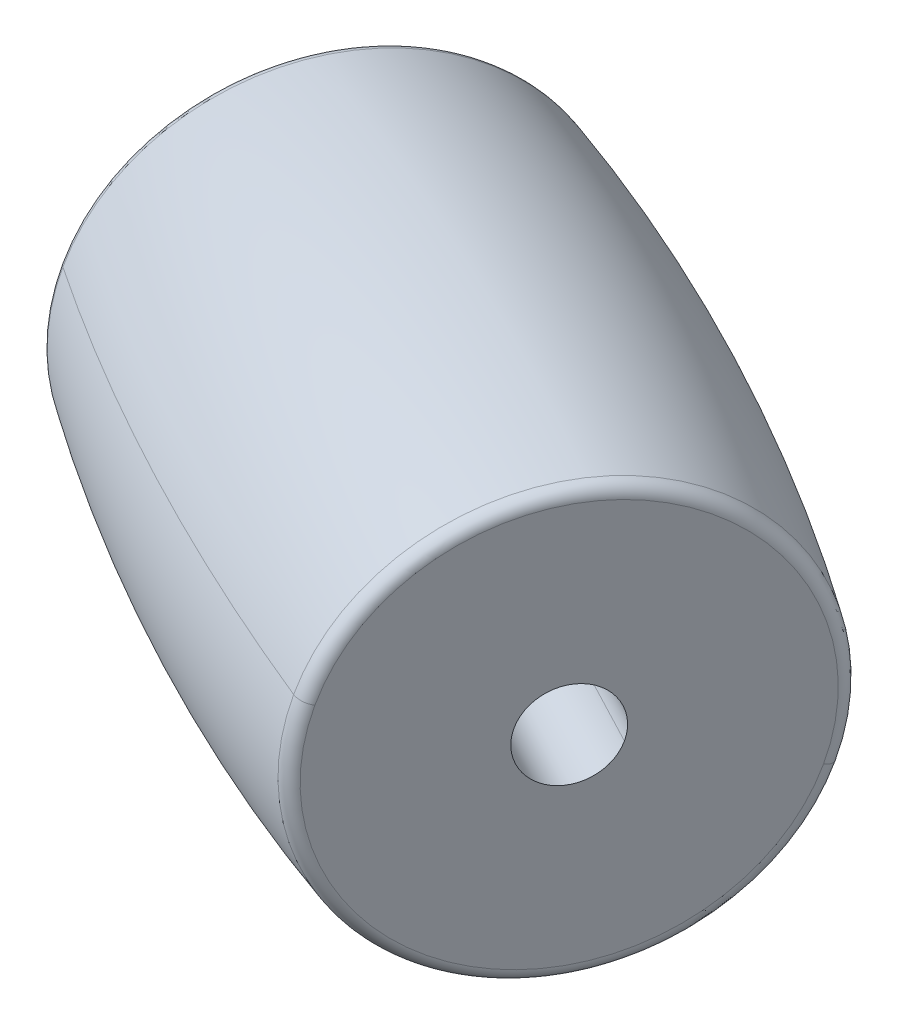
ISO-10303-21;
HEADER;
FILE_DESCRIPTION(('STEP AP214'),'2;1');
FILE_NAME('part.step','',(''),(''),'','','');
FILE_SCHEMA(('AUTOMOTIVE_DESIGN { 1 0 10303 214 1 1 1 1 }'));
ENDSEC;
DATA;
#1=APPLICATION_CONTEXT('core data for automotive mechanical design processes');
#2=APPLICATION_PROTOCOL_DEFINITION('international standard','automotive_design',2000,#1);
#3=PRODUCT_CONTEXT('',#1,'mechanical');
#4=PRODUCT('Part','Part','',(#3));
#5=PRODUCT_RELATED_PRODUCT_CATEGORY('part','',(#4));
#6=PRODUCT_DEFINITION_FORMATION('','',#4);
#7=PRODUCT_DEFINITION_CONTEXT('part definition',#1,'design');
#8=PRODUCT_DEFINITION('design','',#6,#7);
#9=PRODUCT_DEFINITION_SHAPE('','',#8);
#10=(LENGTH_UNIT() NAMED_UNIT(*) SI_UNIT(.MILLI.,.METRE.));
#11=(NAMED_UNIT(*) PLANE_ANGLE_UNIT() SI_UNIT($,.RADIAN.));
#12=(NAMED_UNIT(*) SI_UNIT($,.STERADIAN.) SOLID_ANGLE_UNIT());
#13=UNCERTAINTY_MEASURE_WITH_UNIT(LENGTH_MEASURE(1.E-05),#10,'distance_accuracy_value','');
#14=(GEOMETRIC_REPRESENTATION_CONTEXT(3) GLOBAL_UNCERTAINTY_ASSIGNED_CONTEXT((#13)) GLOBAL_UNIT_ASSIGNED_CONTEXT((#10,
#11,#12)) REPRESENTATION_CONTEXT('',''));
#15=CARTESIAN_POINT('',(0.,0.,0.));
#16=DIRECTION('',(0.,0.,1.));
#17=DIRECTION('',(1.,0.,0.));
#18=AXIS2_PLACEMENT_3D('',#15,#16,#17);
#19=CARTESIAN_POINT('',(7.64193139777357,7.10002,-47.3864496764052));
#20=DIRECTION('',(0.885456025653216,0.,0.464723172043757));
#21=DIRECTION('',(0.439263469313461,-0.326447496805942,-0.836946614997538));
#22=AXIS2_PLACEMENT_3D('',#19,#20,#21);
#23=CYLINDRICAL_SURFACE('',#22,1.);
#24=DIRECTION('',(0.885456025653216,0.,0.464723172043757));
#25=VECTOR('',#24,1.);
#26=CARTESIAN_POINT('',(7.20266792846011,7.42646749680594,-46.5495030614076));
#27=LINE('',#26,#25);
#28=CARTESIAN_POINT('',(14.8662783210863,7.42646749680594,-42.5273300479693));
#29=VERTEX_POINT('',#28);
#30=CARTESIAN_POINT('',(26.5542978597088,7.42646749680594,-36.3929841769917));
#31=VERTEX_POINT('',#30);
#32=EDGE_CURVE('E154',#29,#31,#27,.T.);
#33=ORIENTED_EDGE('',*,*,#32,.F.);
#34=CARTESIAN_POINT('',(15.3055417903998,7.10002,-43.3642766629668));
#35=DIRECTION('',(-0.885456025653216,0.,-0.464723172043757));
#36=DIRECTION('',(0.439263469313461,-0.326447496805942,-0.836946614997538));
#37=AXIS2_PLACEMENT_3D('',#34,#35,#36);
#38=CIRCLE('',#37,1.);
#39=CARTESIAN_POINT('',(15.7448052597132,6.77357250319406,-44.2012232779643));
#40=VERTEX_POINT('',#39);
#41=EDGE_CURVE('E11',#29,#40,#38,.T.);
#42=ORIENTED_EDGE('',*,*,#41,.T.);
#43=DIRECTION('',(0.885456025653216,0.,0.464723172043757));
#44=VECTOR('',#43,1.);
#45=CARTESIAN_POINT('',(8.08119486708703,6.77357250319406,-48.2233962914027));
#46=LINE('',#45,#44);
#47=CARTESIAN_POINT('',(27.4328247983357,6.77357250319406,-38.0668774069867));
#48=VERTEX_POINT('',#47);
#49=EDGE_CURVE('E141',#40,#48,#46,.T.);
#50=ORIENTED_EDGE('',*,*,#49,.T.);
#51=CARTESIAN_POINT('',(26.9935613290222,7.10002,-37.2299307919892));
#52=DIRECTION('',(0.885456025653216,0.,0.464723172043757));
#53=DIRECTION('',(0.439263469313461,-0.326447496805942,-0.836946614997538));
#54=AXIS2_PLACEMENT_3D('',#51,#52,#53);
#55=CIRCLE('',#54,1.);
#56=EDGE_CURVE('E76',#48,#31,#55,.T.);
#57=ORIENTED_EDGE('',*,*,#56,.T.);
#58=EDGE_LOOP('',(#33,#42,#50,#57));
#59=FACE_BOUND('',#58,.T.);
#60=ADVANCED_FACE('F17',(#59),#23,.F.);
#61=CARTESIAN_POINT('',(26.7279245213263,7.10002,-37.3693477436023));
#62=DIRECTION('',(-0.885456025653216,0.,-0.464723172043757));
#63=DIRECTION('',(-0.439263469313461,0.326447496805942,0.836946614997538));
#64=AXIS2_PLACEMENT_3D('',#61,#62,#63);
#65=TOROIDAL_SURFACE('',#64,4.60548872129678,0.3);
#66=CARTESIAN_POINT('',(28.7509474749271,5.59656973536467,-41.223895939301));
#67=DIRECTION('',(0.151707716221402,0.945215336221929,-0.28905490310623));
#68=DIRECTION('',(0.439263469313461,-0.326447496805942,-0.836946614997538));
#69=AXIS2_PLACEMENT_3D('',#66,#67,#68);
#70=CIRCLE('',#69,0.3);
#71=CARTESIAN_POINT('',(29.0165842826231,5.59656973536467,-41.0844789876879));
#72=VERTEX_POINT('',#71);
#73=CARTESIAN_POINT('',(28.9148358933567,5.49940055891335,-41.4556258196627));
#74=VERTEX_POINT('',#73);
#75=EDGE_CURVE('E140',#72,#74,#70,.T.);
#76=ORIENTED_EDGE('',*,*,#75,.F.);
#77=CARTESIAN_POINT('',(26.9935613290222,7.10002,-37.2299307919892));
#78=DIRECTION('',(0.885456025653216,0.,0.464723172043757));
#79=DIRECTION('',(-0.439263469313461,0.326447496805942,0.836946614997538));
#80=AXIS2_PLACEMENT_3D('',#77,#78,#79);
#81=CIRCLE('',#80,4.60548872129678);
#82=CARTESIAN_POINT('',(24.9705383754214,8.60347026463533,-33.3753825962905));
#83=VERTEX_POINT('',#82);
#84=EDGE_CURVE('E132',#83,#72,#81,.T.);
#85=ORIENTED_EDGE('',*,*,#84,.F.);
#86=CARTESIAN_POINT('',(24.7049015677254,8.60347026463533,-33.5147995479037));
#87=DIRECTION('',(-0.151707716221402,-0.945215336221929,0.28905490310623));
#88=DIRECTION('',(-0.439263469313461,0.326447496805942,0.836946614997538));
#89=AXIS2_PLACEMENT_3D('',#86,#87,#88);
#90=CIRCLE('',#89,0.3);
#91=CARTESIAN_POINT('',(24.6072908478497,8.70063944108665,-33.2482844479316));
#92=VERTEX_POINT('',#91);
#93=EDGE_CURVE('E119',#83,#92,#90,.T.);
#94=ORIENTED_EDGE('',*,*,#93,.T.);
#95=CARTESIAN_POINT('',(26.7610633706032,7.10002,-37.3519551337971));
#96=DIRECTION('',(-0.885456025653216,0.,-0.464723172043757));
#97=DIRECTION('',(-0.439263469313461,0.326447496805942,0.836946614997538));
#98=AXIS2_PLACEMENT_3D('',#95,#96,#97);
#99=CIRCLE('',#98,4.90314508993815);
#100=EDGE_CURVE('E130',#74,#92,#99,.T.);
#101=ORIENTED_EDGE('',*,*,#100,.F.);
#102=EDGE_LOOP('',(#76,#85,#94,#101));
#103=FACE_BOUND('',#102,.T.);
#104=ADVANCED_FACE('F186',(#103),#65,.T.);
#105=CARTESIAN_POINT('',(15.5711785980957,7.10002,-43.2248597113537));
#106=DIRECTION('',(0.885456025653216,0.,0.464723172043757));
#107=DIRECTION('',(0.439263469313461,-0.326447496805942,-0.836946614997538));
#108=AXIS2_PLACEMENT_3D('',#105,#106,#107);
#109=TOROIDAL_SURFACE('',#108,4.60548872129678,0.3);
#110=CARTESIAN_POINT('',(13.5481556444949,8.60347026463533,-39.370311515655));
#111=DIRECTION('',(0.151707716221402,0.945215336221929,-0.28905490310623));
#112=DIRECTION('',(0.439263469313461,-0.326447496805942,-0.836946614997538));
#113=AXIS2_PLACEMENT_3D('',#110,#111,#112);
#114=CIRCLE('',#113,0.3);
#115=CARTESIAN_POINT('',(13.2825188367989,8.60347026463533,-39.5097284672681));
#116=VERTEX_POINT('',#115);
#117=CARTESIAN_POINT('',(13.3842672260653,8.70063944108665,-39.1385816352933));
#118=VERTEX_POINT('',#117);
#119=EDGE_CURVE('E106',#116,#118,#114,.T.);
#120=ORIENTED_EDGE('',*,*,#119,.F.);
#121=CARTESIAN_POINT('',(15.3055417903998,7.10002,-43.3642766629668));
#122=DIRECTION('',(-0.885456025653216,0.,-0.464723172043757));
#123=DIRECTION('',(0.439263469313461,-0.326447496805942,-0.836946614997538));
#124=AXIS2_PLACEMENT_3D('',#121,#122,#123);
#125=CIRCLE('',#124,4.60548872129678);
#126=CARTESIAN_POINT('',(17.3285647440006,5.59656973536467,-47.2188248586655));
#127=VERTEX_POINT('',#126);
#128=EDGE_CURVE('E21',#127,#116,#125,.T.);
#129=ORIENTED_EDGE('',*,*,#128,.F.);
#130=CARTESIAN_POINT('',(17.5942015516966,5.59656973536467,-47.0794079070523));
#131=DIRECTION('',(-0.151707716221402,-0.945215336221929,0.28905490310623));
#132=DIRECTION('',(-0.439263469313461,0.326447496805942,0.836946614997538));
#133=AXIS2_PLACEMENT_3D('',#130,#131,#132);
#134=CIRCLE('',#133,0.3);
#135=CARTESIAN_POINT('',(17.6918122715723,5.49940055891335,-47.3459230070244));
#136=VERTEX_POINT('',#135);
#137=EDGE_CURVE('E103',#127,#136,#134,.T.);
#138=ORIENTED_EDGE('',*,*,#137,.T.);
#139=CARTESIAN_POINT('',(15.5380397488188,7.10002,-43.2422523211589));
#140=DIRECTION('',(0.885456025653216,0.,0.464723172043757));
#141=DIRECTION('',(0.439263469313461,-0.326447496805942,-0.836946614997538));
#142=AXIS2_PLACEMENT_3D('',#139,#140,#141);
#143=CIRCLE('',#142,4.90314508993815);
#144=EDGE_CURVE('E42',#118,#136,#143,.T.);
#145=ORIENTED_EDGE('',*,*,#144,.F.);
#146=EDGE_LOOP('',(#120,#129,#138,#145));
#147=FACE_BOUND('',#146,.T.);
#148=ADVANCED_FACE('F102',(#147),#109,.T.);
#149=CARTESIAN_POINT('',(16.0442726803153,11.7026848075697,-44.7718107760931));
#150=DIRECTION('',(0.885456025653216,0.,0.464723172043757));
#151=DIRECTION('',(0.439263469313461,-0.326447496805942,-0.836946614997538));
#152=AXIS2_PLACEMENT_3D('',#149,#150,#151);
#153=PLANE('',#152);
#154=CARTESIAN_POINT('',(15.3055417903998,7.10002,-43.3642766629668));
#155=DIRECTION('',(-0.885456025653216,0.,-0.464723172043757));
#156=DIRECTION('',(0.439263469313461,-0.326447496805942,-0.836946614997538));
#157=AXIS2_PLACEMENT_3D('',#154,#155,#156);
#158=CIRCLE('',#157,1.);
#159=EDGE_CURVE('E159',#40,#29,#158,.T.);
#160=ORIENTED_EDGE('',*,*,#159,.F.);
#161=ORIENTED_EDGE('',*,*,#41,.F.);
#162=EDGE_LOOP('',(#160,#161));
#163=FACE_BOUND('',#162,.T.);
#164=ORIENTED_EDGE('',*,*,#128,.T.);
#165=CARTESIAN_POINT('',(15.3055417903998,7.10002,-43.3642766629668));
#166=DIRECTION('',(-0.885456025653216,0.,-0.464723172043757));
#167=DIRECTION('',(0.439263469313461,-0.326447496805942,-0.836946614997538));
#168=AXIS2_PLACEMENT_3D('',#165,#166,#167);
#169=CIRCLE('',#168,4.60548872129678);
#170=EDGE_CURVE('E111',#116,#127,#169,.T.);
#171=ORIENTED_EDGE('',*,*,#170,.T.);
#172=EDGE_LOOP('',(#164,#171));
#173=FACE_BOUND('',#172,.T.);
#174=ADVANCED_FACE('F117',(#163,#173),#153,.F.);
#175=CARTESIAN_POINT('',(27.7322922189377,11.7026848075697,-38.6374649051155));
#176=DIRECTION('',(-0.885456025653216,0.,-0.464723172043757));
#177=DIRECTION('',(0.151707716221402,0.945215336221929,-0.28905490310623));
#178=AXIS2_PLACEMENT_3D('',#175,#176,#177);
#179=PLANE('',#178);
#180=ORIENTED_EDGE('',*,*,#56,.F.);
#181=CARTESIAN_POINT('',(26.9935613290222,7.10002,-37.2299307919892));
#182=DIRECTION('',(0.885456025653216,0.,0.464723172043757));
#183=DIRECTION('',(0.439263469313461,-0.326447496805942,-0.836946614997538));
#184=AXIS2_PLACEMENT_3D('',#181,#182,#183);
#185=CIRCLE('',#184,1.);
#186=EDGE_CURVE('E158',#31,#48,#185,.T.);
#187=ORIENTED_EDGE('',*,*,#186,.F.);
#188=EDGE_LOOP('',(#180,#187));
#189=FACE_BOUND('',#188,.T.);
#190=ORIENTED_EDGE('',*,*,#84,.T.);
#191=CARTESIAN_POINT('',(26.9935613290222,7.10002,-37.2299307919892));
#192=DIRECTION('',(0.885456025653216,0.,0.464723172043757));
#193=DIRECTION('',(-0.439263469313461,0.326447496805942,0.836946614997538));
#194=AXIS2_PLACEMENT_3D('',#191,#192,#193);
#195=CIRCLE('',#194,4.60548872129678);
#196=EDGE_CURVE('E136',#72,#83,#195,.T.);
#197=ORIENTED_EDGE('',*,*,#196,.T.);
#198=EDGE_LOOP('',(#190,#197));
#199=FACE_BOUND('',#198,.T.);
#200=ADVANCED_FACE('F178',(#189,#199),#179,.F.);
#201=CARTESIAN_POINT('',(21.149551559711,7.10002,-40.297103727478));
#202=DIRECTION('',(0.885456025653216,0.,0.464723172043757));
#203=DIRECTION('',(-0.439263469313461,0.326447496805942,0.836946614997538));
#204=AXIS2_PLACEMENT_3D('',#201,#202,#203);
#205=DEGENERATE_TOROIDAL_SURFACE('',#204,45.5,50.8,.F.);
#206=CARTESIAN_POINT('',(41.1360394134735,-7.75334110467036,-78.378174709866));
#207=DIRECTION('',(0.151707716221402,0.945215336221929,-0.28905490310623));
#208=DIRECTION('',(0.439263469313461,-0.326447496805942,-0.836946614997538));
#209=AXIS2_PLACEMENT_3D('',#206,#207,#208);
#210=CIRCLE('',#209,50.8);
#211=EDGE_CURVE('E115',#118,#92,#210,.T.);
#212=ORIENTED_EDGE('',*,*,#211,.F.);
#213=ORIENTED_EDGE('',*,*,#144,.T.);
#214=CARTESIAN_POINT('',(1.16306370594851,21.9533811046704,-2.21603274509005));
#215=DIRECTION('',(-0.151707716221402,-0.945215336221929,0.28905490310623));
#216=DIRECTION('',(-0.439263469313461,0.326447496805942,0.836946614997538));
#217=AXIS2_PLACEMENT_3D('',#214,#215,#216);
#218=CIRCLE('',#217,50.8);
#219=EDGE_CURVE('E135',#136,#74,#218,.T.);
#220=ORIENTED_EDGE('',*,*,#219,.T.);
#221=ORIENTED_EDGE('',*,*,#100,.T.);
#222=EDGE_LOOP('',(#212,#213,#220,#221));
#223=FACE_BOUND('',#222,.T.);
#224=ADVANCED_FACE('F19',(#223),#205,.F.);
#225=CARTESIAN_POINT('',(21.149551559711,7.10002,-40.297103727478));
#226=DIRECTION('',(0.885456025653216,0.,0.464723172043757));
#227=DIRECTION('',(-0.439263469313461,0.326447496805942,0.836946614997538));
#228=AXIS2_PLACEMENT_3D('',#225,#226,#227);
#229=DEGENERATE_TOROIDAL_SURFACE('',#228,45.5,50.8,.F.);
#230=CARTESIAN_POINT('',(15.5380397488188,7.10002,-43.2422523211589));
#231=DIRECTION('',(0.885456025653216,0.,0.464723172043757));
#232=DIRECTION('',(0.439263469313461,-0.326447496805942,-0.836946614997538));
#233=AXIS2_PLACEMENT_3D('',#230,#231,#232);
#234=CIRCLE('',#233,4.90314508993815);
#235=EDGE_CURVE('E113',#136,#118,#234,.T.);
#236=ORIENTED_EDGE('',*,*,#235,.T.);
#237=ORIENTED_EDGE('',*,*,#211,.T.);
#238=CARTESIAN_POINT('',(26.7610633706032,7.10002,-37.3519551337971));
#239=DIRECTION('',(-0.885456025653216,0.,-0.464723172043757));
#240=DIRECTION('',(-0.439263469313461,0.326447496805942,0.836946614997538));
#241=AXIS2_PLACEMENT_3D('',#238,#239,#240);
#242=CIRCLE('',#241,4.90314508993815);
#243=EDGE_CURVE('E127',#92,#74,#242,.T.);
#244=ORIENTED_EDGE('',*,*,#243,.T.);
#245=ORIENTED_EDGE('',*,*,#219,.F.);
#246=EDGE_LOOP('',(#236,#237,#244,#245));
#247=FACE_BOUND('',#246,.T.);
#248=ADVANCED_FACE('F191',(#247),#229,.F.);
#249=CARTESIAN_POINT('',(15.5711785980957,7.10002,-43.2248597113537));
#250=DIRECTION('',(0.885456025653216,0.,0.464723172043757));
#251=DIRECTION('',(0.439263469313461,-0.326447496805942,-0.836946614997538));
#252=AXIS2_PLACEMENT_3D('',#249,#250,#251);
#253=TOROIDAL_SURFACE('',#252,4.60548872129678,0.3);
#254=ORIENTED_EDGE('',*,*,#170,.F.);
#255=ORIENTED_EDGE('',*,*,#119,.T.);
#256=ORIENTED_EDGE('',*,*,#235,.F.);
#257=ORIENTED_EDGE('',*,*,#137,.F.);
#258=EDGE_LOOP('',(#254,#255,#256,#257));
#259=FACE_BOUND('',#258,.T.);
#260=ADVANCED_FACE('F110',(#259),#253,.T.);
#261=CARTESIAN_POINT('',(26.7279245213263,7.10002,-37.3693477436023));
#262=DIRECTION('',(-0.885456025653216,0.,-0.464723172043757));
#263=DIRECTION('',(-0.439263469313461,0.326447496805942,0.836946614997538));
#264=AXIS2_PLACEMENT_3D('',#261,#262,#263);
#265=TOROIDAL_SURFACE('',#264,4.60548872129678,0.3);
#266=ORIENTED_EDGE('',*,*,#196,.F.);
#267=ORIENTED_EDGE('',*,*,#75,.T.);
#268=ORIENTED_EDGE('',*,*,#243,.F.);
#269=ORIENTED_EDGE('',*,*,#93,.F.);
#270=EDGE_LOOP('',(#266,#267,#268,#269));
#271=FACE_BOUND('',#270,.T.);
#272=ADVANCED_FACE('F189',(#271),#265,.T.);
#273=CARTESIAN_POINT('',(7.64193139777357,7.10002,-47.3864496764052));
#274=DIRECTION('',(0.885456025653216,0.,0.464723172043757));
#275=DIRECTION('',(0.439263469313461,-0.326447496805942,-0.836946614997538));
#276=AXIS2_PLACEMENT_3D('',#273,#274,#275);
#277=CYLINDRICAL_SURFACE('',#276,1.);
#278=ORIENTED_EDGE('',*,*,#159,.T.);
#279=ORIENTED_EDGE('',*,*,#32,.T.);
#280=ORIENTED_EDGE('',*,*,#186,.T.);
#281=ORIENTED_EDGE('',*,*,#49,.F.);
#282=EDGE_LOOP('',(#278,#279,#280,#281));
#283=FACE_BOUND('',#282,.T.);
#284=ADVANCED_FACE('F177',(#283),#277,.F.);
#285=CLOSED_SHELL('',(#60,#104,#148,#174,#200,#224,#248,#260,#272,#284));
#286=MANIFOLD_SOLID_BREP('B1',#285);
#287=ADVANCED_BREP_SHAPE_REPRESENTATION('',(#18,#286),#14);
#288=SHAPE_DEFINITION_REPRESENTATION(#9,#287);
ENDSEC;
END-ISO-10303-21;
